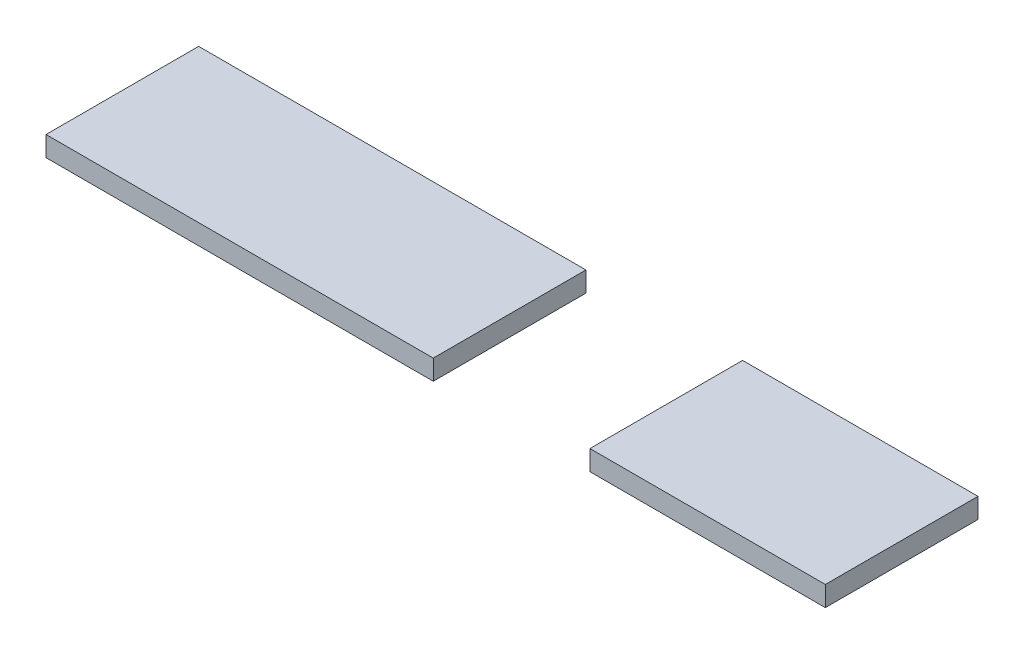
ISO-10303-21;
HEADER;
FILE_DESCRIPTION(('STEP AP214'),'2;1');
FILE_NAME('part.step','',(''),(''),'','','');
FILE_SCHEMA(('AUTOMOTIVE_DESIGN { 1 0 10303 214 1 1 1 1 }'));
ENDSEC;
DATA;
#1=APPLICATION_CONTEXT('core data for automotive mechanical design processes');
#2=APPLICATION_PROTOCOL_DEFINITION('international standard','automotive_design',2000,#1);
#3=PRODUCT_CONTEXT('',#1,'mechanical');
#4=PRODUCT('Part','Part','',(#3));
#5=PRODUCT_RELATED_PRODUCT_CATEGORY('part','',(#4));
#6=PRODUCT_DEFINITION_FORMATION('','',#4);
#7=PRODUCT_DEFINITION_CONTEXT('part definition',#1,'design');
#8=PRODUCT_DEFINITION('design','',#6,#7);
#9=PRODUCT_DEFINITION_SHAPE('','',#8);
#10=(LENGTH_UNIT() NAMED_UNIT(*) SI_UNIT(.MILLI.,.METRE.));
#11=(NAMED_UNIT(*) PLANE_ANGLE_UNIT() SI_UNIT($,.RADIAN.));
#12=(NAMED_UNIT(*) SI_UNIT($,.STERADIAN.) SOLID_ANGLE_UNIT());
#13=UNCERTAINTY_MEASURE_WITH_UNIT(LENGTH_MEASURE(1.E-05),#10,'distance_accuracy_value','');
#14=(GEOMETRIC_REPRESENTATION_CONTEXT(3) GLOBAL_UNCERTAINTY_ASSIGNED_CONTEXT((#13)) GLOBAL_UNIT_ASSIGNED_CONTEXT((#10,
#11,#12)) REPRESENTATION_CONTEXT('',''));
#15=CARTESIAN_POINT('',(0.,0.,0.));
#16=DIRECTION('',(0.,0.,1.));
#17=DIRECTION('',(1.,0.,0.));
#18=AXIS2_PLACEMENT_3D('',#15,#16,#17);
#19=CARTESIAN_POINT('',(-33.5487856107446,2.5,-19.));
#20=DIRECTION('',(1.,0.,0.));
#21=DIRECTION('',(0.,0.,-1.));
#22=AXIS2_PLACEMENT_3D('',#19,#20,#21);
#23=PLANE('',#22);
#24=DIRECTION('',(0.,0.,1.));
#25=VECTOR('',#24,1.);
#26=CARTESIAN_POINT('',(-33.5487856107446,0.,-19.));
#27=LINE('',#26,#25);
#28=CARTESIAN_POINT('',(-33.5487856107446,0.,-19.));
#29=VERTEX_POINT('',#28);
#30=CARTESIAN_POINT('',(-33.5487856107446,0.,0.));
#31=VERTEX_POINT('',#30);
#32=EDGE_CURVE('E110',#29,#31,#27,.T.);
#33=ORIENTED_EDGE('',*,*,#32,.T.);
#34=DIRECTION('',(0.,-1.,0.));
#35=VECTOR('',#34,1.);
#36=CARTESIAN_POINT('',(-33.5487856107446,2.5,0.));
#37=LINE('',#36,#35);
#38=CARTESIAN_POINT('',(-33.5487856107446,2.5,0.));
#39=VERTEX_POINT('',#38);
#40=EDGE_CURVE('E12',#39,#31,#37,.T.);
#41=ORIENTED_EDGE('',*,*,#40,.F.);
#42=DIRECTION('',(0.,0.,1.));
#43=VECTOR('',#42,1.);
#44=CARTESIAN_POINT('',(-33.5487856107446,2.5,-19.));
#45=LINE('',#44,#43);
#46=CARTESIAN_POINT('',(-33.5487856107446,2.5,-19.));
#47=VERTEX_POINT('',#46);
#48=EDGE_CURVE('E98',#47,#39,#45,.T.);
#49=ORIENTED_EDGE('',*,*,#48,.F.);
#50=DIRECTION('',(0.,-1.,0.));
#51=VECTOR('',#50,1.);
#52=CARTESIAN_POINT('',(-33.5487856107446,2.5,-19.));
#53=LINE('',#52,#51);
#54=EDGE_CURVE('E106',#47,#29,#53,.T.);
#55=ORIENTED_EDGE('',*,*,#54,.T.);
#56=EDGE_LOOP('',(#33,#41,#49,#55));
#57=FACE_BOUND('',#56,.T.);
#58=ADVANCED_FACE('F47',(#57),#23,.F.);
#59=CARTESIAN_POINT('',(-33.5487856107446,2.5,0.));
#60=DIRECTION('',(0.,0.,-1.));
#61=DIRECTION('',(-1.,0.,0.));
#62=AXIS2_PLACEMENT_3D('',#59,#60,#61);
#63=PLANE('',#62);
#64=DIRECTION('',(1.,0.,0.));
#65=VECTOR('',#64,1.);
#66=CARTESIAN_POINT('',(-33.5487856107446,0.,0.));
#67=LINE('',#66,#65);
#68=CARTESIAN_POINT('',(-4.2487856107446,0.,0.));
#69=VERTEX_POINT('',#68);
#70=EDGE_CURVE('E102',#31,#69,#67,.T.);
#71=ORIENTED_EDGE('',*,*,#70,.T.);
#72=DIRECTION('',(0.,-1.,0.));
#73=VECTOR('',#72,1.);
#74=CARTESIAN_POINT('',(-4.2487856107446,2.5,0.));
#75=LINE('',#74,#73);
#76=CARTESIAN_POINT('',(-4.2487856107446,2.5,0.));
#77=VERTEX_POINT('',#76);
#78=EDGE_CURVE('E55',#77,#69,#75,.T.);
#79=ORIENTED_EDGE('',*,*,#78,.F.);
#80=DIRECTION('',(1.,0.,0.));
#81=VECTOR('',#80,1.);
#82=CARTESIAN_POINT('',(-33.5487856107446,2.5,0.));
#83=LINE('',#82,#81);
#84=EDGE_CURVE('E93',#39,#77,#83,.T.);
#85=ORIENTED_EDGE('',*,*,#84,.F.);
#86=ORIENTED_EDGE('',*,*,#40,.T.);
#87=EDGE_LOOP('',(#71,#79,#85,#86));
#88=FACE_BOUND('',#87,.T.);
#89=ADVANCED_FACE('F101',(#88),#63,.F.);
#90=CARTESIAN_POINT('',(-4.2487856107446,2.5,-19.));
#91=DIRECTION('',(-1.,0.,0.));
#92=DIRECTION('',(0.,0.,1.));
#93=AXIS2_PLACEMENT_3D('',#90,#91,#92);
#94=PLANE('',#93);
#95=DIRECTION('',(0.,0.,-1.));
#96=VECTOR('',#95,1.);
#97=CARTESIAN_POINT('',(-4.2487856107446,0.,-19.));
#98=LINE('',#97,#96);
#99=CARTESIAN_POINT('',(-4.2487856107446,0.,-19.));
#100=VERTEX_POINT('',#99);
#101=EDGE_CURVE('E80',#69,#100,#98,.T.);
#102=ORIENTED_EDGE('',*,*,#101,.T.);
#103=DIRECTION('',(0.,-1.,0.));
#104=VECTOR('',#103,1.);
#105=CARTESIAN_POINT('',(-4.2487856107446,2.5,-19.));
#106=LINE('',#105,#104);
#107=CARTESIAN_POINT('',(-4.2487856107446,2.5,-19.));
#108=VERTEX_POINT('',#107);
#109=EDGE_CURVE('E103',#108,#100,#106,.T.);
#110=ORIENTED_EDGE('',*,*,#109,.F.);
#111=DIRECTION('',(0.,0.,-1.));
#112=VECTOR('',#111,1.);
#113=CARTESIAN_POINT('',(-4.2487856107446,2.5,-19.));
#114=LINE('',#113,#112);
#115=EDGE_CURVE('E96',#77,#108,#114,.T.);
#116=ORIENTED_EDGE('',*,*,#115,.F.);
#117=ORIENTED_EDGE('',*,*,#78,.T.);
#118=EDGE_LOOP('',(#102,#110,#116,#117));
#119=FACE_BOUND('',#118,.T.);
#120=ADVANCED_FACE('F104',(#119),#94,.F.);
#121=CARTESIAN_POINT('',(-33.5487856107446,2.5,-19.));
#122=DIRECTION('',(0.,0.,1.));
#123=DIRECTION('',(1.,0.,0.));
#124=AXIS2_PLACEMENT_3D('',#121,#122,#123);
#125=PLANE('',#124);
#126=DIRECTION('',(-1.,0.,0.));
#127=VECTOR('',#126,1.);
#128=CARTESIAN_POINT('',(-33.5487856107446,0.,-19.));
#129=LINE('',#128,#127);
#130=EDGE_CURVE('E86',#100,#29,#129,.T.);
#131=ORIENTED_EDGE('',*,*,#130,.T.);
#132=ORIENTED_EDGE('',*,*,#54,.F.);
#133=DIRECTION('',(-1.,0.,0.));
#134=VECTOR('',#133,1.);
#135=CARTESIAN_POINT('',(-33.5487856107446,2.5,-19.));
#136=LINE('',#135,#134);
#137=EDGE_CURVE('E63',#108,#47,#136,.T.);
#138=ORIENTED_EDGE('',*,*,#137,.F.);
#139=ORIENTED_EDGE('',*,*,#109,.T.);
#140=EDGE_LOOP('',(#131,#132,#138,#139));
#141=FACE_BOUND('',#140,.T.);
#142=ADVANCED_FACE('F117',(#141),#125,.F.);
#143=CARTESIAN_POINT('',(0.,2.5,0.));
#144=DIRECTION('',(0.,1.,0.));
#145=DIRECTION('',(0.,0.,1.));
#146=AXIS2_PLACEMENT_3D('',#143,#144,#145);
#147=PLANE('',#146);
#148=ORIENTED_EDGE('',*,*,#48,.T.);
#149=ORIENTED_EDGE('',*,*,#84,.T.);
#150=ORIENTED_EDGE('',*,*,#115,.T.);
#151=ORIENTED_EDGE('',*,*,#137,.T.);
#152=EDGE_LOOP('',(#148,#149,#150,#151));
#153=FACE_BOUND('',#152,.T.);
#154=ADVANCED_FACE('F94',(#153),#147,.T.);
#155=CARTESIAN_POINT('',(0.,0.,0.));
#156=DIRECTION('',(0.,1.,0.));
#157=DIRECTION('',(0.,0.,1.));
#158=AXIS2_PLACEMENT_3D('',#155,#156,#157);
#159=PLANE('',#158);
#160=ORIENTED_EDGE('',*,*,#32,.F.);
#161=ORIENTED_EDGE('',*,*,#130,.F.);
#162=ORIENTED_EDGE('',*,*,#101,.F.);
#163=ORIENTED_EDGE('',*,*,#70,.F.);
#164=EDGE_LOOP('',(#160,#161,#162,#163));
#165=FACE_BOUND('',#164,.T.);
#166=ADVANCED_FACE('F120',(#165),#159,.F.);
#167=CLOSED_SHELL('',(#58,#89,#120,#142,#154,#166));
#168=MANIFOLD_SOLID_BREP('B2',#167);
#169=CARTESIAN_POINT('',(-101.248785610745,2.5,-19.));
#170=DIRECTION('',(1.,0.,0.));
#171=DIRECTION('',(0.,0.,-1.));
#172=AXIS2_PLACEMENT_3D('',#169,#170,#171);
#173=PLANE('',#172);
#174=DIRECTION('',(0.,0.,1.));
#175=VECTOR('',#174,1.);
#176=CARTESIAN_POINT('',(-101.248785610745,0.,-19.));
#177=LINE('',#176,#175);
#178=CARTESIAN_POINT('',(-101.248785610745,0.,-19.));
#179=VERTEX_POINT('',#178);
#180=CARTESIAN_POINT('',(-101.248785610745,0.,0.));
#181=VERTEX_POINT('',#180);
#182=EDGE_CURVE('E234',#179,#181,#177,.T.);
#183=ORIENTED_EDGE('',*,*,#182,.T.);
#184=DIRECTION('',(0.,-1.,0.));
#185=VECTOR('',#184,1.);
#186=CARTESIAN_POINT('',(-101.248785610745,2.5,0.));
#187=LINE('',#186,#185);
#188=CARTESIAN_POINT('',(-101.248785610745,2.5,0.));
#189=VERTEX_POINT('',#188);
#190=EDGE_CURVE('E45',#189,#181,#187,.T.);
#191=ORIENTED_EDGE('',*,*,#190,.F.);
#192=DIRECTION('',(0.,0.,1.));
#193=VECTOR('',#192,1.);
#194=CARTESIAN_POINT('',(-101.248785610745,2.5,-19.));
#195=LINE('',#194,#193);
#196=CARTESIAN_POINT('',(-101.248785610745,2.5,-19.));
#197=VERTEX_POINT('',#196);
#198=EDGE_CURVE('E222',#197,#189,#195,.T.);
#199=ORIENTED_EDGE('',*,*,#198,.F.);
#200=DIRECTION('',(0.,-1.,0.));
#201=VECTOR('',#200,1.);
#202=CARTESIAN_POINT('',(-101.248785610745,2.5,-19.));
#203=LINE('',#202,#201);
#204=EDGE_CURVE('E230',#197,#179,#203,.T.);
#205=ORIENTED_EDGE('',*,*,#204,.T.);
#206=EDGE_LOOP('',(#183,#191,#199,#205));
#207=FACE_BOUND('',#206,.T.);
#208=ADVANCED_FACE('F171',(#207),#173,.F.);
#209=CARTESIAN_POINT('',(-101.248785610745,2.5,0.));
#210=DIRECTION('',(0.,0.,-1.));
#211=DIRECTION('',(-1.,0.,0.));
#212=AXIS2_PLACEMENT_3D('',#209,#210,#211);
#213=PLANE('',#212);
#214=DIRECTION('',(1.,0.,0.));
#215=VECTOR('',#214,1.);
#216=CARTESIAN_POINT('',(-101.248785610745,0.,0.));
#217=LINE('',#216,#215);
#218=CARTESIAN_POINT('',(-53.0487856107446,0.,0.));
#219=VERTEX_POINT('',#218);
#220=EDGE_CURVE('E226',#181,#219,#217,.T.);
#221=ORIENTED_EDGE('',*,*,#220,.T.);
#222=DIRECTION('',(0.,-1.,0.));
#223=VECTOR('',#222,1.);
#224=CARTESIAN_POINT('',(-53.0487856107446,2.5,0.));
#225=LINE('',#224,#223);
#226=CARTESIAN_POINT('',(-53.0487856107446,2.5,0.));
#227=VERTEX_POINT('',#226);
#228=EDGE_CURVE('E179',#227,#219,#225,.T.);
#229=ORIENTED_EDGE('',*,*,#228,.F.);
#230=DIRECTION('',(1.,0.,0.));
#231=VECTOR('',#230,1.);
#232=CARTESIAN_POINT('',(-101.248785610745,2.5,0.));
#233=LINE('',#232,#231);
#234=EDGE_CURVE('E217',#189,#227,#233,.T.);
#235=ORIENTED_EDGE('',*,*,#234,.F.);
#236=ORIENTED_EDGE('',*,*,#190,.T.);
#237=EDGE_LOOP('',(#221,#229,#235,#236));
#238=FACE_BOUND('',#237,.T.);
#239=ADVANCED_FACE('F225',(#238),#213,.F.);
#240=CARTESIAN_POINT('',(-53.0487856107446,2.5,-19.));
#241=DIRECTION('',(-1.,0.,0.));
#242=DIRECTION('',(0.,0.,1.));
#243=AXIS2_PLACEMENT_3D('',#240,#241,#242);
#244=PLANE('',#243);
#245=DIRECTION('',(0.,0.,-1.));
#246=VECTOR('',#245,1.);
#247=CARTESIAN_POINT('',(-53.0487856107446,0.,-19.));
#248=LINE('',#247,#246);
#249=CARTESIAN_POINT('',(-53.0487856107446,0.,-19.));
#250=VERTEX_POINT('',#249);
#251=EDGE_CURVE('E204',#219,#250,#248,.T.);
#252=ORIENTED_EDGE('',*,*,#251,.T.);
#253=DIRECTION('',(0.,-1.,0.));
#254=VECTOR('',#253,1.);
#255=CARTESIAN_POINT('',(-53.0487856107446,2.5,-19.));
#256=LINE('',#255,#254);
#257=CARTESIAN_POINT('',(-53.0487856107446,2.5,-19.));
#258=VERTEX_POINT('',#257);
#259=EDGE_CURVE('E227',#258,#250,#256,.T.);
#260=ORIENTED_EDGE('',*,*,#259,.F.);
#261=DIRECTION('',(0.,0.,-1.));
#262=VECTOR('',#261,1.);
#263=CARTESIAN_POINT('',(-53.0487856107446,2.5,-19.));
#264=LINE('',#263,#262);
#265=EDGE_CURVE('E220',#227,#258,#264,.T.);
#266=ORIENTED_EDGE('',*,*,#265,.F.);
#267=ORIENTED_EDGE('',*,*,#228,.T.);
#268=EDGE_LOOP('',(#252,#260,#266,#267));
#269=FACE_BOUND('',#268,.T.);
#270=ADVANCED_FACE('F228',(#269),#244,.F.);
#271=CARTESIAN_POINT('',(-101.248785610745,2.5,-19.));
#272=DIRECTION('',(0.,0.,1.));
#273=DIRECTION('',(1.,0.,0.));
#274=AXIS2_PLACEMENT_3D('',#271,#272,#273);
#275=PLANE('',#274);
#276=DIRECTION('',(-1.,0.,0.));
#277=VECTOR('',#276,1.);
#278=CARTESIAN_POINT('',(-101.248785610745,0.,-19.));
#279=LINE('',#278,#277);
#280=EDGE_CURVE('E210',#250,#179,#279,.T.);
#281=ORIENTED_EDGE('',*,*,#280,.T.);
#282=ORIENTED_EDGE('',*,*,#204,.F.);
#283=DIRECTION('',(-1.,0.,0.));
#284=VECTOR('',#283,1.);
#285=CARTESIAN_POINT('',(-101.248785610745,2.5,-19.));
#286=LINE('',#285,#284);
#287=EDGE_CURVE('E187',#258,#197,#286,.T.);
#288=ORIENTED_EDGE('',*,*,#287,.F.);
#289=ORIENTED_EDGE('',*,*,#259,.T.);
#290=EDGE_LOOP('',(#281,#282,#288,#289));
#291=FACE_BOUND('',#290,.T.);
#292=ADVANCED_FACE('F241',(#291),#275,.F.);
#293=CARTESIAN_POINT('',(0.,2.5,0.));
#294=DIRECTION('',(0.,1.,0.));
#295=DIRECTION('',(0.,0.,1.));
#296=AXIS2_PLACEMENT_3D('',#293,#294,#295);
#297=PLANE('',#296);
#298=ORIENTED_EDGE('',*,*,#198,.T.);
#299=ORIENTED_EDGE('',*,*,#234,.T.);
#300=ORIENTED_EDGE('',*,*,#265,.T.);
#301=ORIENTED_EDGE('',*,*,#287,.T.);
#302=EDGE_LOOP('',(#298,#299,#300,#301));
#303=FACE_BOUND('',#302,.T.);
#304=ADVANCED_FACE('F218',(#303),#297,.T.);
#305=CARTESIAN_POINT('',(0.,0.,0.));
#306=DIRECTION('',(0.,1.,0.));
#307=DIRECTION('',(0.,0.,1.));
#308=AXIS2_PLACEMENT_3D('',#305,#306,#307);
#309=PLANE('',#308);
#310=ORIENTED_EDGE('',*,*,#182,.F.);
#311=ORIENTED_EDGE('',*,*,#280,.F.);
#312=ORIENTED_EDGE('',*,*,#251,.F.);
#313=ORIENTED_EDGE('',*,*,#220,.F.);
#314=EDGE_LOOP('',(#310,#311,#312,#313));
#315=FACE_BOUND('',#314,.T.);
#316=ADVANCED_FACE('F244',(#315),#309,.F.);
#317=CLOSED_SHELL('',(#208,#239,#270,#292,#304,#316));
#318=MANIFOLD_SOLID_BREP('B6',#317);
#319=ADVANCED_BREP_SHAPE_REPRESENTATION('',(#18,#168,#318),#14);
#320=SHAPE_DEFINITION_REPRESENTATION(#9,#319);
ENDSEC;
END-ISO-10303-21;
